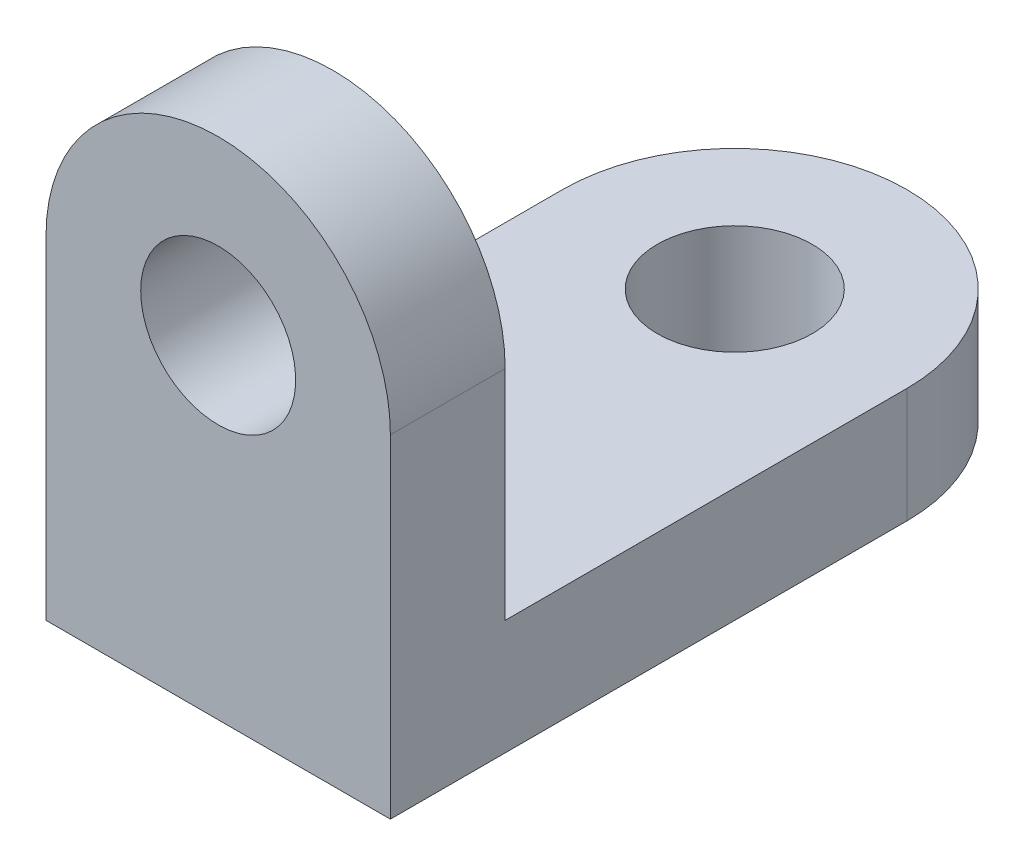
ISO-10303-21;
HEADER;
FILE_DESCRIPTION(('STEP AP214'),'2;1');
FILE_NAME('part.step','',(''),(''),'','','');
FILE_SCHEMA(('AUTOMOTIVE_DESIGN { 1 0 10303 214 1 1 1 1 }'));
ENDSEC;
DATA;
#1=APPLICATION_CONTEXT('core data for automotive mechanical design processes');
#2=APPLICATION_PROTOCOL_DEFINITION('international standard','automotive_design',2000,#1);
#3=PRODUCT_CONTEXT('',#1,'mechanical');
#4=PRODUCT('Part','Part','',(#3));
#5=PRODUCT_RELATED_PRODUCT_CATEGORY('part','',(#4));
#6=PRODUCT_DEFINITION_FORMATION('','',#4);
#7=PRODUCT_DEFINITION_CONTEXT('part definition',#1,'design');
#8=PRODUCT_DEFINITION('design','',#6,#7);
#9=PRODUCT_DEFINITION_SHAPE('','',#8);
#10=(LENGTH_UNIT() NAMED_UNIT(*) SI_UNIT(.MILLI.,.METRE.));
#11=(NAMED_UNIT(*) PLANE_ANGLE_UNIT() SI_UNIT($,.RADIAN.));
#12=(NAMED_UNIT(*) SI_UNIT($,.STERADIAN.) SOLID_ANGLE_UNIT());
#13=UNCERTAINTY_MEASURE_WITH_UNIT(LENGTH_MEASURE(1.E-05),#10,'distance_accuracy_value','');
#14=(GEOMETRIC_REPRESENTATION_CONTEXT(3) GLOBAL_UNCERTAINTY_ASSIGNED_CONTEXT((#13)) GLOBAL_UNIT_ASSIGNED_CONTEXT((#10,
#11,#12)) REPRESENTATION_CONTEXT('',''));
#15=CARTESIAN_POINT('',(0.,0.,0.));
#16=DIRECTION('',(0.,0.,1.));
#17=DIRECTION('',(1.,0.,0.));
#18=AXIS2_PLACEMENT_3D('',#15,#16,#17);
#19=CARTESIAN_POINT('',(0.,14.5,13.2603092783505));
#20=DIRECTION('',(0.,0.,1.));
#21=DIRECTION('',(1.,0.,0.));
#22=AXIS2_PLACEMENT_3D('',#19,#20,#21);
#23=CYLINDRICAL_SURFACE('',#22,7.5);
#24=DIRECTION('',(0.,0.,-1.));
#25=VECTOR('',#24,1.);
#26=CARTESIAN_POINT('',(-7.5,14.5,13.2603092783505));
#27=LINE('',#26,#25);
#28=CARTESIAN_POINT('',(-7.5,14.5,13.2603092783505));
#29=VERTEX_POINT('',#28);
#30=CARTESIAN_POINT('',(-7.5,14.5,8.26030927835053));
#31=VERTEX_POINT('',#30);
#32=EDGE_CURVE('E99',#29,#31,#27,.T.);
#33=ORIENTED_EDGE('',*,*,#32,.F.);
#34=CARTESIAN_POINT('',(0.,14.5,13.2603092783505));
#35=DIRECTION('',(0.,0.,-1.));
#36=DIRECTION('',(-1.,0.,0.));
#37=AXIS2_PLACEMENT_3D('',#34,#35,#36);
#38=CIRCLE('',#37,7.5);
#39=CARTESIAN_POINT('',(7.5,14.5,13.2603092783505));
#40=VERTEX_POINT('',#39);
#41=EDGE_CURVE('E51',#40,#29,#38,.F.);
#42=ORIENTED_EDGE('',*,*,#41,.F.);
#43=DIRECTION('',(0.,0.,-1.));
#44=VECTOR('',#43,1.);
#45=CARTESIAN_POINT('',(7.5,14.5,13.2603092783505));
#46=LINE('',#45,#44);
#47=CARTESIAN_POINT('',(7.5,14.5,8.26030927835053));
#48=VERTEX_POINT('',#47);
#49=EDGE_CURVE('E161',#48,#40,#46,.F.);
#50=ORIENTED_EDGE('',*,*,#49,.F.);
#51=CARTESIAN_POINT('',(0.,14.5,8.26030927835053));
#52=DIRECTION('',(0.,0.,1.));
#53=DIRECTION('',(1.,0.,0.));
#54=AXIS2_PLACEMENT_3D('',#51,#52,#53);
#55=CIRCLE('',#54,7.5);
#56=EDGE_CURVE('E11',#31,#48,#55,.F.);
#57=ORIENTED_EDGE('',*,*,#56,.F.);
#58=EDGE_LOOP('',(#33,#42,#50,#57));
#59=FACE_BOUND('',#58,.T.);
#60=ADVANCED_FACE('F41',(#59),#23,.T.);
#61=CARTESIAN_POINT('',(0.,5.,-9.23969072164947));
#62=DIRECTION('',(0.,-1.,0.));
#63=DIRECTION('',(0.,0.,-1.));
#64=AXIS2_PLACEMENT_3D('',#61,#62,#63);
#65=CYLINDRICAL_SURFACE('',#64,7.5);
#66=DIRECTION('',(0.,-1.,0.));
#67=VECTOR('',#66,1.);
#68=CARTESIAN_POINT('',(-7.5,5.,-9.23969072164947));
#69=LINE('',#68,#67);
#70=CARTESIAN_POINT('',(-7.5,5.,-9.23969072164947));
#71=VERTEX_POINT('',#70);
#72=CARTESIAN_POINT('',(-7.5,0.,-9.23969072164947));
#73=VERTEX_POINT('',#72);
#74=EDGE_CURVE('E147',#71,#73,#69,.T.);
#75=ORIENTED_EDGE('',*,*,#74,.F.);
#76=CARTESIAN_POINT('',(0.,5.,-9.23969072164947));
#77=DIRECTION('',(0.,1.,0.));
#78=DIRECTION('',(0.,0.,1.));
#79=AXIS2_PLACEMENT_3D('',#76,#77,#78);
#80=CIRCLE('',#79,7.5);
#81=CARTESIAN_POINT('',(7.5,5.,-9.23969072164947));
#82=VERTEX_POINT('',#81);
#83=EDGE_CURVE('E110',#82,#71,#80,.T.);
#84=ORIENTED_EDGE('',*,*,#83,.F.);
#85=DIRECTION('',(0.,-1.,0.));
#86=VECTOR('',#85,1.);
#87=CARTESIAN_POINT('',(7.5,5.,-9.23969072164947));
#88=LINE('',#87,#86);
#89=CARTESIAN_POINT('',(7.5,0.,-9.23969072164947));
#90=VERTEX_POINT('',#89);
#91=EDGE_CURVE('E150',#90,#82,#88,.F.);
#92=ORIENTED_EDGE('',*,*,#91,.F.);
#93=CARTESIAN_POINT('',(0.,0.,-9.23969072164947));
#94=DIRECTION('',(0.,1.,0.));
#95=DIRECTION('',(0.,0.,1.));
#96=AXIS2_PLACEMENT_3D('',#93,#94,#95);
#97=CIRCLE('',#96,7.5);
#98=EDGE_CURVE('E156',#73,#90,#97,.F.);
#99=ORIENTED_EDGE('',*,*,#98,.F.);
#100=EDGE_LOOP('',(#75,#84,#92,#99));
#101=FACE_BOUND('',#100,.T.);
#102=ADVANCED_FACE('F177',(#101),#65,.T.);
#103=CARTESIAN_POINT('',(7.5,5.,-16.7396907216495));
#104=DIRECTION('',(-1.,0.,0.));
#105=DIRECTION('',(0.,0.,1.));
#106=AXIS2_PLACEMENT_3D('',#103,#104,#105);
#107=PLANE('',#106);
#108=DIRECTION('',(0.,-1.,0.));
#109=VECTOR('',#108,1.);
#110=CARTESIAN_POINT('',(7.5,22.,8.26030927835053));
#111=LINE('',#110,#109);
#112=CARTESIAN_POINT('',(7.5,5.,8.26030927835053));
#113=VERTEX_POINT('',#112);
#114=EDGE_CURVE('E102',#48,#113,#111,.T.);
#115=ORIENTED_EDGE('',*,*,#114,.F.);
#116=ORIENTED_EDGE('',*,*,#49,.T.);
#117=DIRECTION('',(0.,-1.,0.));
#118=VECTOR('',#117,1.);
#119=CARTESIAN_POINT('',(7.5,5.,13.2603092783505));
#120=LINE('',#119,#118);
#121=CARTESIAN_POINT('',(7.5,0.,13.2603092783505));
#122=VERTEX_POINT('',#121);
#123=EDGE_CURVE('E113',#40,#122,#120,.T.);
#124=ORIENTED_EDGE('',*,*,#123,.T.);
#125=DIRECTION('',(0.,0.,-1.));
#126=VECTOR('',#125,1.);
#127=CARTESIAN_POINT('',(7.5,0.,-16.7396907216495));
#128=LINE('',#127,#126);
#129=EDGE_CURVE('E128',#122,#90,#128,.T.);
#130=ORIENTED_EDGE('',*,*,#129,.T.);
#131=ORIENTED_EDGE('',*,*,#91,.T.);
#132=DIRECTION('',(0.,0.,-1.));
#133=VECTOR('',#132,1.);
#134=CARTESIAN_POINT('',(7.5,5.,-16.7396907216495));
#135=LINE('',#134,#133);
#136=EDGE_CURVE('E114',#113,#82,#135,.T.);
#137=ORIENTED_EDGE('',*,*,#136,.F.);
#138=EDGE_LOOP('',(#115,#116,#124,#130,#131,#137));
#139=FACE_BOUND('',#138,.T.);
#140=ADVANCED_FACE('F175',(#139),#107,.F.);
#141=CARTESIAN_POINT('',(-7.5,5.,-16.7396907216495));
#142=DIRECTION('',(1.,0.,0.));
#143=DIRECTION('',(0.,0.,-1.));
#144=AXIS2_PLACEMENT_3D('',#141,#142,#143);
#145=PLANE('',#144);
#146=DIRECTION('',(0.,-1.,0.));
#147=VECTOR('',#146,1.);
#148=CARTESIAN_POINT('',(-7.5,5.,13.2603092783505));
#149=LINE('',#148,#147);
#150=CARTESIAN_POINT('',(-7.5,0.,13.2603092783505));
#151=VERTEX_POINT('',#150);
#152=EDGE_CURVE('E144',#29,#151,#149,.T.);
#153=ORIENTED_EDGE('',*,*,#152,.F.);
#154=ORIENTED_EDGE('',*,*,#32,.T.);
#155=DIRECTION('',(0.,-1.,0.));
#156=VECTOR('',#155,1.);
#157=CARTESIAN_POINT('',(-7.5,22.,8.26030927835053));
#158=LINE('',#157,#156);
#159=CARTESIAN_POINT('',(-7.5,5.,8.26030927835053));
#160=VERTEX_POINT('',#159);
#161=EDGE_CURVE('E93',#31,#160,#158,.T.);
#162=ORIENTED_EDGE('',*,*,#161,.T.);
#163=DIRECTION('',(0.,0.,1.));
#164=VECTOR('',#163,1.);
#165=CARTESIAN_POINT('',(-7.5,5.,-16.7396907216495));
#166=LINE('',#165,#164);
#167=EDGE_CURVE('E98',#71,#160,#166,.T.);
#168=ORIENTED_EDGE('',*,*,#167,.F.);
#169=ORIENTED_EDGE('',*,*,#74,.T.);
#170=DIRECTION('',(0.,0.,1.));
#171=VECTOR('',#170,1.);
#172=CARTESIAN_POINT('',(-7.5,0.,-16.7396907216495));
#173=LINE('',#172,#171);
#174=EDGE_CURVE('E135',#73,#151,#173,.T.);
#175=ORIENTED_EDGE('',*,*,#174,.T.);
#176=EDGE_LOOP('',(#153,#154,#162,#168,#169,#175));
#177=FACE_BOUND('',#176,.T.);
#178=ADVANCED_FACE('F96',(#177),#145,.F.);
#179=CARTESIAN_POINT('',(-7.5,5.,13.2603092783505));
#180=DIRECTION('',(0.,0.,-1.));
#181=DIRECTION('',(-1.,0.,0.));
#182=AXIS2_PLACEMENT_3D('',#179,#180,#181);
#183=PLANE('',#182);
#184=CARTESIAN_POINT('',(0.,14.5,13.2603092783505));
#185=DIRECTION('',(0.,0.,-1.));
#186=DIRECTION('',(-1.,0.,0.));
#187=AXIS2_PLACEMENT_3D('',#184,#185,#186);
#188=CIRCLE('',#187,3.375);
#189=CARTESIAN_POINT('',(-3.375,14.5,13.2603092783505));
#190=VERTEX_POINT('',#189);
#191=EDGE_CURVE('E217',#190,#190,#188,.T.);
#192=ORIENTED_EDGE('',*,*,#191,.T.);
#193=EDGE_LOOP('',(#192));
#194=FACE_BOUND('',#193,.T.);
#195=ORIENTED_EDGE('',*,*,#123,.F.);
#196=ORIENTED_EDGE('',*,*,#41,.T.);
#197=ORIENTED_EDGE('',*,*,#152,.T.);
#198=DIRECTION('',(1.,0.,0.));
#199=VECTOR('',#198,1.);
#200=CARTESIAN_POINT('',(-7.5,0.,13.2603092783505));
#201=LINE('',#200,#199);
#202=EDGE_CURVE('E130',#151,#122,#201,.T.);
#203=ORIENTED_EDGE('',*,*,#202,.T.);
#204=EDGE_LOOP('',(#195,#196,#197,#203));
#205=FACE_BOUND('',#204,.T.);
#206=ADVANCED_FACE('F167',(#194,#205),#183,.F.);
#207=CARTESIAN_POINT('',(0.,5.,0.));
#208=DIRECTION('',(0.,1.,0.));
#209=DIRECTION('',(0.,0.,1.));
#210=AXIS2_PLACEMENT_3D('',#207,#208,#209);
#211=PLANE('',#210);
#212=CARTESIAN_POINT('',(0.,5.,-9.23969072164947));
#213=DIRECTION('',(0.,1.,0.));
#214=DIRECTION('',(0.,0.,1.));
#215=AXIS2_PLACEMENT_3D('',#212,#213,#214);
#216=CIRCLE('',#215,3.375);
#217=CARTESIAN_POINT('',(0.,5.,-5.86469072164947));
#218=VERTEX_POINT('',#217);
#219=EDGE_CURVE('E122',#218,#218,#216,.T.);
#220=ORIENTED_EDGE('',*,*,#219,.F.);
#221=EDGE_LOOP('',(#220));
#222=FACE_BOUND('',#221,.T.);
#223=ORIENTED_EDGE('',*,*,#136,.T.);
#224=ORIENTED_EDGE('',*,*,#83,.T.);
#225=ORIENTED_EDGE('',*,*,#167,.T.);
#226=DIRECTION('',(-1.,0.,0.));
#227=VECTOR('',#226,1.);
#228=CARTESIAN_POINT('',(-7.5,5.,8.26030927835053));
#229=LINE('',#228,#227);
#230=EDGE_CURVE('E103',#113,#160,#229,.T.);
#231=ORIENTED_EDGE('',*,*,#230,.F.);
#232=EDGE_LOOP('',(#223,#224,#225,#231));
#233=FACE_BOUND('',#232,.T.);
#234=ADVANCED_FACE('F108',(#222,#233),#211,.T.);
#235=CARTESIAN_POINT('',(0.,0.,0.));
#236=DIRECTION('',(0.,1.,0.));
#237=DIRECTION('',(0.,0.,1.));
#238=AXIS2_PLACEMENT_3D('',#235,#236,#237);
#239=PLANE('',#238);
#240=CARTESIAN_POINT('',(0.,0.,-9.23969072164947));
#241=DIRECTION('',(0.,1.,0.));
#242=DIRECTION('',(0.,0.,1.));
#243=AXIS2_PLACEMENT_3D('',#240,#241,#242);
#244=CIRCLE('',#243,3.375);
#245=CARTESIAN_POINT('',(0.,0.,-5.86469072164947));
#246=VERTEX_POINT('',#245);
#247=EDGE_CURVE('E45',#246,#246,#244,.T.);
#248=ORIENTED_EDGE('',*,*,#247,.T.);
#249=EDGE_LOOP('',(#248));
#250=FACE_BOUND('',#249,.T.);
#251=ORIENTED_EDGE('',*,*,#174,.F.);
#252=ORIENTED_EDGE('',*,*,#98,.T.);
#253=ORIENTED_EDGE('',*,*,#129,.F.);
#254=ORIENTED_EDGE('',*,*,#202,.F.);
#255=EDGE_LOOP('',(#251,#252,#253,#254));
#256=FACE_BOUND('',#255,.T.);
#257=ADVANCED_FACE('F172',(#250,#256),#239,.F.);
#258=CARTESIAN_POINT('',(-7.5,22.,8.26030927835053));
#259=DIRECTION('',(0.,0.,1.));
#260=DIRECTION('',(1.,0.,0.));
#261=AXIS2_PLACEMENT_3D('',#258,#259,#260);
#262=PLANE('',#261);
#263=CARTESIAN_POINT('',(0.,14.5,8.26030927835053));
#264=DIRECTION('',(0.,0.,-1.));
#265=DIRECTION('',(-1.,0.,0.));
#266=AXIS2_PLACEMENT_3D('',#263,#264,#265);
#267=CIRCLE('',#266,3.375);
#268=CARTESIAN_POINT('',(-3.375,14.5,8.26030927835053));
#269=VERTEX_POINT('',#268);
#270=EDGE_CURVE('E214',#269,#269,#267,.T.);
#271=ORIENTED_EDGE('',*,*,#270,.F.);
#272=EDGE_LOOP('',(#271));
#273=FACE_BOUND('',#272,.T.);
#274=ORIENTED_EDGE('',*,*,#161,.F.);
#275=ORIENTED_EDGE('',*,*,#56,.T.);
#276=ORIENTED_EDGE('',*,*,#114,.T.);
#277=ORIENTED_EDGE('',*,*,#230,.T.);
#278=EDGE_LOOP('',(#274,#275,#276,#277));
#279=FACE_BOUND('',#278,.T.);
#280=ADVANCED_FACE('F116',(#273,#279),#262,.F.);
#281=CARTESIAN_POINT('',(0.,-5.,-9.23969072164947));
#282=DIRECTION('',(0.,1.,0.));
#283=DIRECTION('',(0.,0.,1.));
#284=AXIS2_PLACEMENT_3D('',#281,#282,#283);
#285=CYLINDRICAL_SURFACE('',#284,3.375);
#286=ORIENTED_EDGE('',*,*,#219,.T.);
#287=EDGE_LOOP('',(#286));
#288=FACE_BOUND('',#287,.T.);
#289=ORIENTED_EDGE('',*,*,#247,.F.);
#290=EDGE_LOOP('',(#289));
#291=FACE_BOUND('',#290,.T.);
#292=ADVANCED_FACE('F201',(#288,#291),#285,.F.);
#293=CARTESIAN_POINT('',(0.,14.5,18.2603092783505));
#294=DIRECTION('',(0.,0.,-1.));
#295=DIRECTION('',(-1.,0.,0.));
#296=AXIS2_PLACEMENT_3D('',#293,#294,#295);
#297=CYLINDRICAL_SURFACE('',#296,3.375);
#298=ORIENTED_EDGE('',*,*,#270,.T.);
#299=EDGE_LOOP('',(#298));
#300=FACE_BOUND('',#299,.T.);
#301=ORIENTED_EDGE('',*,*,#191,.F.);
#302=EDGE_LOOP('',(#301));
#303=FACE_BOUND('',#302,.T.);
#304=ADVANCED_FACE('F205',(#300,#303),#297,.F.);
#305=CLOSED_SHELL('',(#60,#102,#140,#178,#206,#234,#257,#280,#292,#304));
#306=MANIFOLD_SOLID_BREP('B2',#305);
#307=ADVANCED_BREP_SHAPE_REPRESENTATION('',(#18,#306),#14);
#308=SHAPE_DEFINITION_REPRESENTATION(#9,#307);
ENDSEC;
END-ISO-10303-21;
